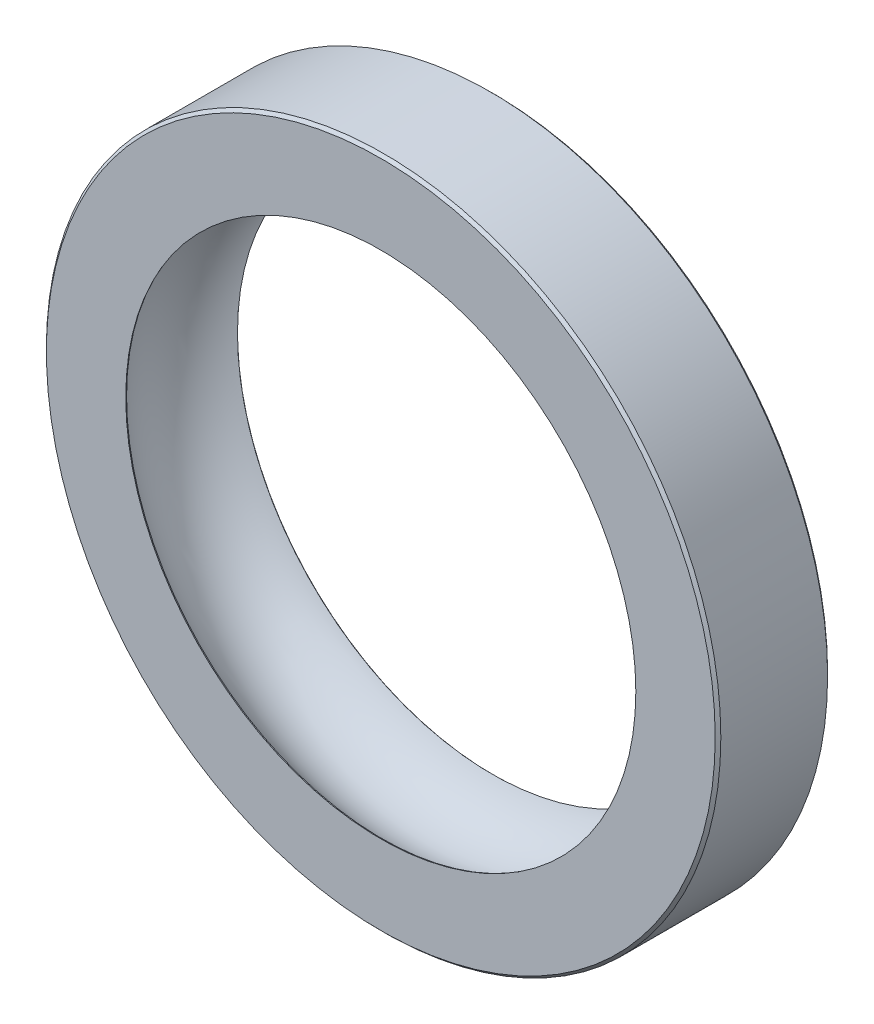
ISO-10303-21;
HEADER;
FILE_DESCRIPTION(('STEP AP214'),'2;1');
FILE_NAME('part.step','',(''),(''),'','','');
FILE_SCHEMA(('AUTOMOTIVE_DESIGN { 1 0 10303 214 1 1 1 1 }'));
ENDSEC;
DATA;
#1=APPLICATION_CONTEXT('core data for automotive mechanical design processes');
#2=APPLICATION_PROTOCOL_DEFINITION('international standard','automotive_design',2000,#1);
#3=PRODUCT_CONTEXT('',#1,'mechanical');
#4=PRODUCT('Part','Part','',(#3));
#5=PRODUCT_RELATED_PRODUCT_CATEGORY('part','',(#4));
#6=PRODUCT_DEFINITION_FORMATION('','',#4);
#7=PRODUCT_DEFINITION_CONTEXT('part definition',#1,'design');
#8=PRODUCT_DEFINITION('design','',#6,#7);
#9=PRODUCT_DEFINITION_SHAPE('','',#8);
#10=(LENGTH_UNIT() NAMED_UNIT(*) SI_UNIT(.MILLI.,.METRE.));
#11=(NAMED_UNIT(*) PLANE_ANGLE_UNIT() SI_UNIT($,.RADIAN.));
#12=(NAMED_UNIT(*) SI_UNIT($,.STERADIAN.) SOLID_ANGLE_UNIT());
#13=UNCERTAINTY_MEASURE_WITH_UNIT(LENGTH_MEASURE(1.E-05),#10,'distance_accuracy_value','');
#14=(GEOMETRIC_REPRESENTATION_CONTEXT(3) GLOBAL_UNCERTAINTY_ASSIGNED_CONTEXT((#13)) GLOBAL_UNIT_ASSIGNED_CONTEXT((#10,
#11,#12)) REPRESENTATION_CONTEXT('',''));
#15=CARTESIAN_POINT('',(0.,0.,0.));
#16=DIRECTION('',(0.,0.,1.));
#17=DIRECTION('',(1.,0.,0.));
#18=AXIS2_PLACEMENT_3D('',#15,#16,#17);
#19=CARTESIAN_POINT('',(0.,0.,10.));
#20=DIRECTION('',(0.,0.,-1.));
#21=DIRECTION('',(-1.,0.,0.));
#22=AXIS2_PLACEMENT_3D('',#19,#20,#21);
#23=CYLINDRICAL_SURFACE('',#22,30.);
#24=CARTESIAN_POINT('',(0.,0.,0.249999999999993));
#25=DIRECTION('',(0.,0.,1.));
#26=DIRECTION('',(1.,0.,0.));
#27=AXIS2_PLACEMENT_3D('',#24,#25,#26);
#28=CIRCLE('',#27,30.);
#29=CARTESIAN_POINT('',(30.,0.,0.249999999999993));
#30=VERTEX_POINT('',#29);
#31=EDGE_CURVE('E69',#30,#30,#28,.T.);
#32=ORIENTED_EDGE('',*,*,#31,.T.);
#33=EDGE_LOOP('',(#32));
#34=FACE_BOUND('',#33,.T.);
#35=CARTESIAN_POINT('',(0.,0.,9.75000000000003));
#36=DIRECTION('',(0.,0.,1.));
#37=DIRECTION('',(1.,0.,0.));
#38=AXIS2_PLACEMENT_3D('',#35,#36,#37);
#39=CIRCLE('',#38,30.);
#40=CARTESIAN_POINT('',(30.,0.,9.75000000000003));
#41=VERTEX_POINT('',#40);
#42=EDGE_CURVE('E72',#41,#41,#39,.F.);
#43=ORIENTED_EDGE('',*,*,#42,.T.);
#44=EDGE_LOOP('',(#43));
#45=FACE_BOUND('',#44,.T.);
#46=ADVANCED_FACE('F42',(#34,#45),#23,.T.);
#47=CARTESIAN_POINT('',(0.,0.,10.));
#48=DIRECTION('',(0.,0.,1.));
#49=DIRECTION('',(1.,0.,0.));
#50=AXIS2_PLACEMENT_3D('',#47,#48,#49);
#51=PLANE('',#50);
#52=CARTESIAN_POINT('',(0.,0.,10.));
#53=DIRECTION('',(0.,0.,1.));
#54=DIRECTION('',(1.,0.,0.));
#55=AXIS2_PLACEMENT_3D('',#52,#53,#54);
#56=CIRCLE('',#55,29.75);
#57=CARTESIAN_POINT('',(29.75,0.,10.));
#58=VERTEX_POINT('',#57);
#59=EDGE_CURVE('E10',#58,#58,#56,.T.);
#60=ORIENTED_EDGE('',*,*,#59,.T.);
#61=EDGE_LOOP('',(#60));
#62=FACE_BOUND('',#61,.T.);
#63=CARTESIAN_POINT('',(0.,0.,10.));
#64=DIRECTION('',(0.,0.,1.));
#65=DIRECTION('',(1.,0.,0.));
#66=AXIS2_PLACEMENT_3D('',#63,#64,#65);
#67=CIRCLE('',#66,22.6885812258111);
#68=CARTESIAN_POINT('',(22.6885812258111,0.,10.));
#69=VERTEX_POINT('',#68);
#70=EDGE_CURVE('E50',#69,#69,#67,.F.);
#71=ORIENTED_EDGE('',*,*,#70,.T.);
#72=EDGE_LOOP('',(#71));
#73=FACE_BOUND('',#72,.T.);
#74=ADVANCED_FACE('F91',(#62,#73),#51,.T.);
#75=CARTESIAN_POINT('',(0.,0.,0.));
#76=DIRECTION('',(0.,0.,1.));
#77=DIRECTION('',(1.,0.,0.));
#78=AXIS2_PLACEMENT_3D('',#75,#76,#77);
#79=PLANE('',#78);
#80=CARTESIAN_POINT('',(0.,0.,0.));
#81=DIRECTION('',(0.,0.,1.));
#82=DIRECTION('',(1.,0.,0.));
#83=AXIS2_PLACEMENT_3D('',#80,#81,#82);
#84=CIRCLE('',#83,29.75);
#85=CARTESIAN_POINT('',(29.75,0.,0.));
#86=VERTEX_POINT('',#85);
#87=EDGE_CURVE('E63',#86,#86,#84,.F.);
#88=ORIENTED_EDGE('',*,*,#87,.T.);
#89=EDGE_LOOP('',(#88));
#90=FACE_BOUND('',#89,.T.);
#91=CARTESIAN_POINT('',(0.,0.,0.));
#92=DIRECTION('',(0.,0.,1.));
#93=DIRECTION('',(1.,0.,0.));
#94=AXIS2_PLACEMENT_3D('',#91,#92,#93);
#95=CIRCLE('',#94,22.7500000000003);
#96=CARTESIAN_POINT('',(22.7500000000003,0.,0.));
#97=VERTEX_POINT('',#96);
#98=EDGE_CURVE('E66',#97,#97,#95,.T.);
#99=ORIENTED_EDGE('',*,*,#98,.T.);
#100=EDGE_LOOP('',(#99));
#101=FACE_BOUND('',#100,.T.);
#102=ADVANCED_FACE('F97',(#90,#101),#79,.F.);
#103=CARTESIAN_POINT('',(0.,0.,5.));
#104=DIRECTION('',(0.,0.,-1.));
#105=DIRECTION('',(-1.,0.,0.));
#106=AXIS2_PLACEMENT_3D('',#103,#104,#105);
#107=TOROIDAL_SURFACE('',#106,20.2087121525221,5.5);
#108=CARTESIAN_POINT('',(0.,0.,0.0809713586242666));
#109=DIRECTION('',(0.,0.,1.));
#110=DIRECTION('',(1.,0.,0.));
#111=AXIS2_PLACEMENT_3D('',#108,#109,#110);
#112=CIRCLE('',#111,22.6690286413757);
#113=CARTESIAN_POINT('',(22.6690286413757,0.,0.0809713586242666));
#114=VERTEX_POINT('',#113);
#115=EDGE_CURVE('E54',#114,#114,#112,.F.);
#116=ORIENTED_EDGE('',*,*,#115,.T.);
#117=EDGE_LOOP('',(#116));
#118=FACE_BOUND('',#117,.T.);
#119=CARTESIAN_POINT('',(0.,0.,9.88795058116161));
#120=DIRECTION('',(0.,0.,-1.));
#121=DIRECTION('',(-1.,0.,0.));
#122=AXIS2_PLACEMENT_3D('',#119,#120,#121);
#123=CIRCLE('',#122,22.7302075651932);
#124=CARTESIAN_POINT('',(-22.7302075651932,0.,9.88795058116161));
#125=VERTEX_POINT('',#124);
#126=EDGE_CURVE('E58',#125,#125,#123,.F.);
#127=ORIENTED_EDGE('',*,*,#126,.T.);
#128=EDGE_LOOP('',(#127));
#129=FACE_BOUND('',#128,.T.);
#130=ADVANCED_FACE('F106',(#118,#129),#107,.F.);
#131=CARTESIAN_POINT('',(0.,0.,0.249999999999993));
#132=DIRECTION('',(0.,0.,1.));
#133=DIRECTION('',(1.,0.,0.));
#134=AXIS2_PLACEMENT_3D('',#131,#132,#133);
#135=CONICAL_SURFACE('',#134,30.,0.785398163397455);
#136=ORIENTED_EDGE('',*,*,#87,.F.);
#137=EDGE_LOOP('',(#136));
#138=FACE_BOUND('',#137,.T.);
#139=ORIENTED_EDGE('',*,*,#31,.F.);
#140=EDGE_LOOP('',(#139));
#141=FACE_BOUND('',#140,.T.);
#142=ADVANCED_FACE('F86',(#138,#141),#135,.T.);
#143=CARTESIAN_POINT('',(0.,0.,0.0809713586242666));
#144=DIRECTION('',(0.,0.,-1.));
#145=DIRECTION('',(-1.,0.,0.));
#146=AXIS2_PLACEMENT_3D('',#143,#144,#145);
#147=CONICAL_SURFACE('',#146,22.6690286413757,0.785398163399023);
#148=ORIENTED_EDGE('',*,*,#98,.F.);
#149=EDGE_LOOP('',(#148));
#150=FACE_BOUND('',#149,.T.);
#151=ORIENTED_EDGE('',*,*,#115,.F.);
#152=EDGE_LOOP('',(#151));
#153=FACE_BOUND('',#152,.T.);
#154=ADVANCED_FACE('F80',(#150,#153),#147,.F.);
#155=CARTESIAN_POINT('',(0.,0.,10.));
#156=DIRECTION('',(0.,0.,-1.));
#157=DIRECTION('',(-1.,0.,0.));
#158=AXIS2_PLACEMENT_3D('',#155,#156,#157);
#159=CONICAL_SURFACE('',#158,29.75,0.785398163397476);
#160=ORIENTED_EDGE('',*,*,#42,.F.);
#161=EDGE_LOOP('',(#160));
#162=FACE_BOUND('',#161,.T.);
#163=ORIENTED_EDGE('',*,*,#59,.F.);
#164=EDGE_LOOP('',(#163));
#165=FACE_BOUND('',#164,.T.);
#166=ADVANCED_FACE('F77',(#162,#165),#159,.T.);
#167=CARTESIAN_POINT('',(0.,0.,10.));
#168=DIRECTION('',(0.,0.,-1.));
#169=DIRECTION('',(-1.,0.,0.));
#170=AXIS2_PLACEMENT_3D('',#167,#168,#169);
#171=CONICAL_SURFACE('',#170,22.6885812258111,0.355698497225864);
#172=ORIENTED_EDGE('',*,*,#126,.F.);
#173=EDGE_LOOP('',(#172));
#174=FACE_BOUND('',#173,.T.);
#175=ORIENTED_EDGE('',*,*,#70,.F.);
#176=EDGE_LOOP('',(#175));
#177=FACE_BOUND('',#176,.T.);
#178=ADVANCED_FACE('F45',(#174,#177),#171,.F.);
#179=CLOSED_SHELL('',(#46,#74,#102,#130,#142,#154,#166,#178));
#180=MANIFOLD_SOLID_BREP('B2',#179);
#181=ADVANCED_BREP_SHAPE_REPRESENTATION('',(#18,#180),#14);
#182=SHAPE_DEFINITION_REPRESENTATION(#9,#181);
ENDSEC;
END-ISO-10303-21;
